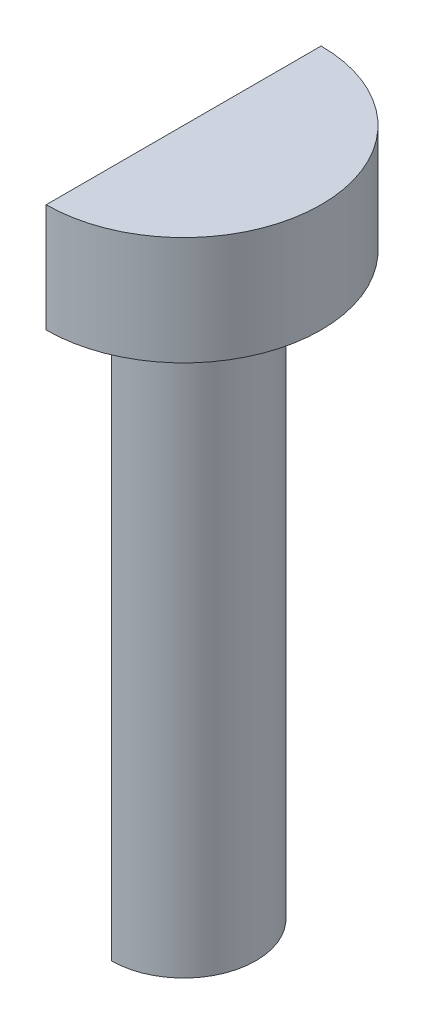
ISO-10303-21;
HEADER;
FILE_DESCRIPTION(('STEP AP214'),'2;1');
FILE_NAME('part.step','',(''),(''),'','','');
FILE_SCHEMA(('AUTOMOTIVE_DESIGN { 1 0 10303 214 1 1 1 1 }'));
ENDSEC;
DATA;
#1=APPLICATION_CONTEXT('core data for automotive mechanical design processes');
#2=APPLICATION_PROTOCOL_DEFINITION('international standard','automotive_design',2000,#1);
#3=PRODUCT_CONTEXT('',#1,'mechanical');
#4=PRODUCT('Part','Part','',(#3));
#5=PRODUCT_RELATED_PRODUCT_CATEGORY('part','',(#4));
#6=PRODUCT_DEFINITION_FORMATION('','',#4);
#7=PRODUCT_DEFINITION_CONTEXT('part definition',#1,'design');
#8=PRODUCT_DEFINITION('design','',#6,#7);
#9=PRODUCT_DEFINITION_SHAPE('','',#8);
#10=(LENGTH_UNIT() NAMED_UNIT(*) SI_UNIT(.MILLI.,.METRE.));
#11=(NAMED_UNIT(*) PLANE_ANGLE_UNIT() SI_UNIT($,.RADIAN.));
#12=(NAMED_UNIT(*) SI_UNIT($,.STERADIAN.) SOLID_ANGLE_UNIT());
#13=UNCERTAINTY_MEASURE_WITH_UNIT(LENGTH_MEASURE(1.E-05),#10,'distance_accuracy_value','');
#14=(GEOMETRIC_REPRESENTATION_CONTEXT(3) GLOBAL_UNCERTAINTY_ASSIGNED_CONTEXT((#13)) GLOBAL_UNIT_ASSIGNED_CONTEXT((#10,
#11,#12)) REPRESENTATION_CONTEXT('',''));
#15=CARTESIAN_POINT('',(0.,0.,0.));
#16=DIRECTION('',(0.,0.,1.));
#17=DIRECTION('',(1.,0.,0.));
#18=AXIS2_PLACEMENT_3D('',#15,#16,#17);
#19=CARTESIAN_POINT('',(0.,109.,-172.));
#20=DIRECTION('',(0.,-1.,0.));
#21=DIRECTION('',(0.,0.,1.));
#22=AXIS2_PLACEMENT_3D('',#19,#20,#21);
#23=PLANE('',#22);
#24=DIRECTION('',(0.,0.,-1.));
#25=VECTOR('',#24,1.);
#26=CARTESIAN_POINT('',(0.,109.,-14.5));
#27=LINE('',#26,#25);
#28=CARTESIAN_POINT('',(0.,109.,-167.));
#29=VERTEX_POINT('',#28);
#30=CARTESIAN_POINT('',(0.,109.,-177.));
#31=VERTEX_POINT('',#30);
#32=EDGE_CURVE('E87',#29,#31,#27,.T.);
#33=ORIENTED_EDGE('',*,*,#32,.T.);
#34=CARTESIAN_POINT('',(0.,109.,-172.));
#35=DIRECTION('',(0.,-1.,0.));
#36=DIRECTION('',(0.,0.,-1.));
#37=AXIS2_PLACEMENT_3D('',#34,#35,#36);
#38=CIRCLE('',#37,5.);
#39=EDGE_CURVE('E27',#31,#29,#38,.T.);
#40=ORIENTED_EDGE('',*,*,#39,.T.);
#41=EDGE_LOOP('',(#33,#40));
#42=FACE_BOUND('',#41,.T.);
#43=ADVANCED_FACE('F17',(#42),#23,.T.);
#44=CARTESIAN_POINT('',(0.,109.,-172.));
#45=DIRECTION('',(0.,-1.,0.));
#46=DIRECTION('',(0.,0.,1.));
#47=AXIS2_PLACEMENT_3D('',#44,#45,#46);
#48=CYLINDRICAL_SURFACE('',#47,5.);
#49=DIRECTION('',(0.,1.,0.));
#50=VECTOR('',#49,1.);
#51=CARTESIAN_POINT('',(0.,109.,-177.));
#52=LINE('',#51,#50);
#53=CARTESIAN_POINT('',(0.,149.,-177.));
#54=VERTEX_POINT('',#53);
#55=EDGE_CURVE('E37',#31,#54,#52,.T.);
#56=ORIENTED_EDGE('',*,*,#55,.T.);
#57=CARTESIAN_POINT('',(0.,149.,-172.));
#58=DIRECTION('',(0.,-1.,0.));
#59=DIRECTION('',(0.,0.,-1.));
#60=AXIS2_PLACEMENT_3D('',#57,#58,#59);
#61=CIRCLE('',#60,5.);
#62=CARTESIAN_POINT('',(0.,149.,-167.));
#63=VERTEX_POINT('',#62);
#64=EDGE_CURVE('E11',#63,#54,#61,.F.);
#65=ORIENTED_EDGE('',*,*,#64,.F.);
#66=DIRECTION('',(0.,-1.,0.));
#67=VECTOR('',#66,1.);
#68=CARTESIAN_POINT('',(0.,109.,-167.));
#69=LINE('',#68,#67);
#70=EDGE_CURVE('E96',#63,#29,#69,.T.);
#71=ORIENTED_EDGE('',*,*,#70,.T.);
#72=ORIENTED_EDGE('',*,*,#39,.F.);
#73=EDGE_LOOP('',(#56,#65,#71,#72));
#74=FACE_BOUND('',#73,.T.);
#75=ADVANCED_FACE('F113',(#74),#48,.T.);
#76=CARTESIAN_POINT('',(0.,149.,-172.));
#77=DIRECTION('',(0.,-1.,0.));
#78=DIRECTION('',(0.,0.,1.));
#79=AXIS2_PLACEMENT_3D('',#76,#77,#78);
#80=PLANE('',#79);
#81=DIRECTION('',(0.,0.,-1.));
#82=VECTOR('',#81,1.);
#83=CARTESIAN_POINT('',(0.,149.,-14.5));
#84=LINE('',#83,#82);
#85=CARTESIAN_POINT('',(0.,149.,-162.5));
#86=VERTEX_POINT('',#85);
#87=EDGE_CURVE('E32',#86,#63,#84,.T.);
#88=ORIENTED_EDGE('',*,*,#87,.T.);
#89=ORIENTED_EDGE('',*,*,#64,.T.);
#90=DIRECTION('',(0.,0.,-1.));
#91=VECTOR('',#90,1.);
#92=CARTESIAN_POINT('',(0.,149.,-14.5));
#93=LINE('',#92,#91);
#94=CARTESIAN_POINT('',(0.,149.,-181.5));
#95=VERTEX_POINT('',#94);
#96=EDGE_CURVE('E84',#54,#95,#93,.T.);
#97=ORIENTED_EDGE('',*,*,#96,.T.);
#98=CARTESIAN_POINT('',(0.,149.,-172.));
#99=DIRECTION('',(0.,1.,0.));
#100=DIRECTION('',(0.,0.,-1.));
#101=AXIS2_PLACEMENT_3D('',#98,#99,#100);
#102=CIRCLE('',#101,9.5);
#103=EDGE_CURVE('E69',#86,#95,#102,.T.);
#104=ORIENTED_EDGE('',*,*,#103,.F.);
#105=EDGE_LOOP('',(#88,#89,#97,#104));
#106=FACE_BOUND('',#105,.T.);
#107=ADVANCED_FACE('F19',(#106),#80,.T.);
#108=CARTESIAN_POINT('',(0.,106.625,-172.));
#109=DIRECTION('',(0.,1.,0.));
#110=DIRECTION('',(0.,0.,1.));
#111=AXIS2_PLACEMENT_3D('',#108,#109,#110);
#112=CYLINDRICAL_SURFACE('',#111,9.5);
#113=DIRECTION('',(0.,-1.,0.));
#114=VECTOR('',#113,1.);
#115=CARTESIAN_POINT('',(0.,152.75,-162.5));
#116=LINE('',#115,#114);
#117=CARTESIAN_POINT('',(0.,156.5,-162.5));
#118=VERTEX_POINT('',#117);
#119=EDGE_CURVE('E64',#118,#86,#116,.T.);
#120=ORIENTED_EDGE('',*,*,#119,.T.);
#121=ORIENTED_EDGE('',*,*,#103,.T.);
#122=DIRECTION('',(0.,1.,0.));
#123=VECTOR('',#122,1.);
#124=CARTESIAN_POINT('',(0.,152.75,-181.5));
#125=LINE('',#124,#123);
#126=CARTESIAN_POINT('',(0.,156.5,-181.5));
#127=VERTEX_POINT('',#126);
#128=EDGE_CURVE('E65',#95,#127,#125,.T.);
#129=ORIENTED_EDGE('',*,*,#128,.T.);
#130=CARTESIAN_POINT('',(0.,156.5,-172.));
#131=DIRECTION('',(0.,1.,0.));
#132=DIRECTION('',(0.,0.,-1.));
#133=AXIS2_PLACEMENT_3D('',#130,#131,#132);
#134=CIRCLE('',#133,9.5);
#135=EDGE_CURVE('E58',#118,#127,#134,.T.);
#136=ORIENTED_EDGE('',*,*,#135,.F.);
#137=EDGE_LOOP('',(#120,#121,#129,#136));
#138=FACE_BOUND('',#137,.T.);
#139=ADVANCED_FACE('F62',(#138),#112,.T.);
#140=CARTESIAN_POINT('',(0.,156.5,-172.));
#141=DIRECTION('',(0.,1.,0.));
#142=DIRECTION('',(0.,0.,1.));
#143=AXIS2_PLACEMENT_3D('',#140,#141,#142);
#144=PLANE('',#143);
#145=DIRECTION('',(0.,0.,1.));
#146=VECTOR('',#145,1.);
#147=CARTESIAN_POINT('',(0.,156.5,-14.5));
#148=LINE('',#147,#146);
#149=EDGE_CURVE('E73',#127,#118,#148,.T.);
#150=ORIENTED_EDGE('',*,*,#149,.T.);
#151=ORIENTED_EDGE('',*,*,#135,.T.);
#152=EDGE_LOOP('',(#150,#151));
#153=FACE_BOUND('',#152,.T.);
#154=ADVANCED_FACE('F76',(#153),#144,.T.);
#155=CARTESIAN_POINT('',(0.,0.,143.));
#156=DIRECTION('',(-1.,0.,0.));
#157=DIRECTION('',(0.,-1.,0.));
#158=AXIS2_PLACEMENT_3D('',#155,#156,#157);
#159=PLANE('',#158);
#160=ORIENTED_EDGE('',*,*,#149,.F.);
#161=ORIENTED_EDGE('',*,*,#128,.F.);
#162=ORIENTED_EDGE('',*,*,#96,.F.);
#163=ORIENTED_EDGE('',*,*,#55,.F.);
#164=ORIENTED_EDGE('',*,*,#32,.F.);
#165=ORIENTED_EDGE('',*,*,#70,.F.);
#166=ORIENTED_EDGE('',*,*,#87,.F.);
#167=ORIENTED_EDGE('',*,*,#119,.F.);
#168=EDGE_LOOP('',(#160,#161,#162,#163,#164,#165,#166,#167));
#169=FACE_BOUND('',#168,.T.);
#170=ADVANCED_FACE('F71',(#169),#159,.T.);
#171=CLOSED_SHELL('',(#43,#75,#107,#139,#154,#170));
#172=MANIFOLD_SOLID_BREP('B1',#171);
#173=ADVANCED_BREP_SHAPE_REPRESENTATION('',(#18,#172),#14);
#174=SHAPE_DEFINITION_REPRESENTATION(#9,#173);
ENDSEC;
END-ISO-10303-21;
